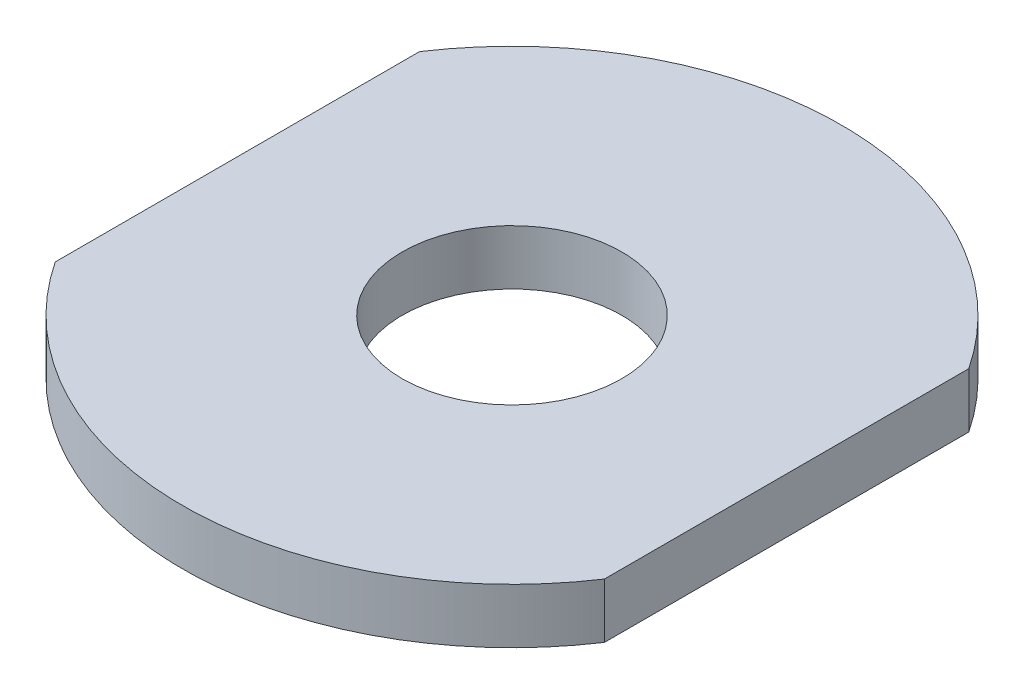
ISO-10303-21;
HEADER;
FILE_DESCRIPTION(('STEP AP214'),'2;1');
FILE_NAME('part.step','',(''),(''),'','','');
FILE_SCHEMA(('AUTOMOTIVE_DESIGN { 1 0 10303 214 1 1 1 1 }'));
ENDSEC;
DATA;
#1=APPLICATION_CONTEXT('core data for automotive mechanical design processes');
#2=APPLICATION_PROTOCOL_DEFINITION('international standard','automotive_design',2000,#1);
#3=PRODUCT_CONTEXT('',#1,'mechanical');
#4=PRODUCT('Part','Part','',(#3));
#5=PRODUCT_RELATED_PRODUCT_CATEGORY('part','',(#4));
#6=PRODUCT_DEFINITION_FORMATION('','',#4);
#7=PRODUCT_DEFINITION_CONTEXT('part definition',#1,'design');
#8=PRODUCT_DEFINITION('design','',#6,#7);
#9=PRODUCT_DEFINITION_SHAPE('','',#8);
#10=(LENGTH_UNIT() NAMED_UNIT(*) SI_UNIT(.MILLI.,.METRE.));
#11=(NAMED_UNIT(*) PLANE_ANGLE_UNIT() SI_UNIT($,.RADIAN.));
#12=(NAMED_UNIT(*) SI_UNIT($,.STERADIAN.) SOLID_ANGLE_UNIT());
#13=UNCERTAINTY_MEASURE_WITH_UNIT(LENGTH_MEASURE(1.E-05),#10,'distance_accuracy_value','');
#14=(GEOMETRIC_REPRESENTATION_CONTEXT(3) GLOBAL_UNCERTAINTY_ASSIGNED_CONTEXT((#13)) GLOBAL_UNIT_ASSIGNED_CONTEXT((#10,
#11,#12)) REPRESENTATION_CONTEXT('',''));
#15=CARTESIAN_POINT('',(0.,0.,0.));
#16=DIRECTION('',(0.,0.,1.));
#17=DIRECTION('',(1.,0.,0.));
#18=AXIS2_PLACEMENT_3D('',#15,#16,#17);
#19=CARTESIAN_POINT('',(0.,1.,0.));
#20=DIRECTION('',(0.,-1.,0.));
#21=DIRECTION('',(0.,0.,-1.));
#22=AXIS2_PLACEMENT_3D('',#19,#20,#21);
#23=CYLINDRICAL_SURFACE('',#22,6.);
#24=CARTESIAN_POINT('',(0.,1.,0.));
#25=DIRECTION('',(0.,1.,0.));
#26=DIRECTION('',(0.,0.,1.));
#27=AXIS2_PLACEMENT_3D('',#24,#25,#26);
#28=CIRCLE('',#27,6.);
#29=CARTESIAN_POINT('',(-5.,1.,3.3166247903554));
#30=VERTEX_POINT('',#29);
#31=CARTESIAN_POINT('',(5.,1.,3.3166247903554));
#32=VERTEX_POINT('',#31);
#33=EDGE_CURVE('E42',#30,#32,#28,.T.);
#34=ORIENTED_EDGE('',*,*,#33,.F.);
#35=DIRECTION('',(0.,1.,0.));
#36=VECTOR('',#35,1.);
#37=CARTESIAN_POINT('',(-5.,0.,3.3166247903554));
#38=LINE('',#37,#36);
#39=CARTESIAN_POINT('',(-5.,0.,3.3166247903554));
#40=VERTEX_POINT('',#39);
#41=EDGE_CURVE('E76',#40,#30,#38,.T.);
#42=ORIENTED_EDGE('',*,*,#41,.F.);
#43=CARTESIAN_POINT('',(0.,0.,0.));
#44=DIRECTION('',(0.,1.,0.));
#45=DIRECTION('',(0.,0.,1.));
#46=AXIS2_PLACEMENT_3D('',#43,#44,#45);
#47=CIRCLE('',#46,6.);
#48=CARTESIAN_POINT('',(5.,0.,3.3166247903554));
#49=VERTEX_POINT('',#48);
#50=EDGE_CURVE('E37',#40,#49,#47,.T.);
#51=ORIENTED_EDGE('',*,*,#50,.T.);
#52=DIRECTION('',(0.,1.,0.));
#53=VECTOR('',#52,1.);
#54=CARTESIAN_POINT('',(5.,0.,3.3166247903554));
#55=LINE('',#54,#53);
#56=EDGE_CURVE('E108',#49,#32,#55,.T.);
#57=ORIENTED_EDGE('',*,*,#56,.T.);
#58=EDGE_LOOP('',(#34,#42,#51,#57));
#59=FACE_BOUND('',#58,.T.);
#60=ADVANCED_FACE('F33',(#59),#23,.T.);
#61=CARTESIAN_POINT('',(0.,1.,0.));
#62=DIRECTION('',(0.,1.,0.));
#63=DIRECTION('',(0.,0.,1.));
#64=AXIS2_PLACEMENT_3D('',#61,#62,#63);
#65=PLANE('',#64);
#66=DIRECTION('',(0.,0.,-1.));
#67=VECTOR('',#66,1.);
#68=CARTESIAN_POINT('',(-5.,1.,3.3166247903554));
#69=LINE('',#68,#67);
#70=CARTESIAN_POINT('',(-5.,1.,-3.3166247903554));
#71=VERTEX_POINT('',#70);
#72=EDGE_CURVE('E49',#30,#71,#69,.T.);
#73=ORIENTED_EDGE('',*,*,#72,.F.);
#74=ORIENTED_EDGE('',*,*,#33,.T.);
#75=DIRECTION('',(0.,0.,1.));
#76=VECTOR('',#75,1.);
#77=CARTESIAN_POINT('',(5.,1.,-3.3166247903554));
#78=LINE('',#77,#76);
#79=CARTESIAN_POINT('',(5.,1.,-3.3166247903554));
#80=VERTEX_POINT('',#79);
#81=EDGE_CURVE('E57',#80,#32,#78,.T.);
#82=ORIENTED_EDGE('',*,*,#81,.F.);
#83=EDGE_CURVE('E11',#80,#71,#28,.T.);
#84=ORIENTED_EDGE('',*,*,#83,.T.);
#85=EDGE_LOOP('',(#73,#74,#82,#84));
#86=FACE_BOUND('',#85,.T.);
#87=CARTESIAN_POINT('',(0.,1.,0.));
#88=DIRECTION('',(0.,1.,0.));
#89=DIRECTION('',(0.,0.,1.));
#90=AXIS2_PLACEMENT_3D('',#87,#88,#89);
#91=CIRCLE('',#90,2.);
#92=CARTESIAN_POINT('',(0.,1.,2.));
#93=VERTEX_POINT('',#92);
#94=EDGE_CURVE('E93',#93,#93,#91,.T.);
#95=ORIENTED_EDGE('',*,*,#94,.F.);
#96=EDGE_LOOP('',(#95));
#97=FACE_BOUND('',#96,.T.);
#98=ADVANCED_FACE('F105',(#86,#97),#65,.T.);
#99=CARTESIAN_POINT('',(0.,0.,0.));
#100=DIRECTION('',(0.,1.,0.));
#101=DIRECTION('',(0.,0.,1.));
#102=AXIS2_PLACEMENT_3D('',#99,#100,#101);
#103=PLANE('',#102);
#104=ORIENTED_EDGE('',*,*,#50,.F.);
#105=DIRECTION('',(0.,0.,-1.));
#106=VECTOR('',#105,1.);
#107=CARTESIAN_POINT('',(-5.,0.,3.3166247903554));
#108=LINE('',#107,#106);
#109=CARTESIAN_POINT('',(-5.,0.,-3.3166247903554));
#110=VERTEX_POINT('',#109);
#111=EDGE_CURVE('E73',#40,#110,#108,.T.);
#112=ORIENTED_EDGE('',*,*,#111,.T.);
#113=CARTESIAN_POINT('',(5.,0.,-3.3166247903554));
#114=VERTEX_POINT('',#113);
#115=EDGE_CURVE('E92',#114,#110,#47,.T.);
#116=ORIENTED_EDGE('',*,*,#115,.F.);
#117=DIRECTION('',(0.,0.,1.));
#118=VECTOR('',#117,1.);
#119=CARTESIAN_POINT('',(5.,0.,-3.3166247903554));
#120=LINE('',#119,#118);
#121=EDGE_CURVE('E91',#114,#49,#120,.T.);
#122=ORIENTED_EDGE('',*,*,#121,.T.);
#123=EDGE_LOOP('',(#104,#112,#116,#122));
#124=FACE_BOUND('',#123,.T.);
#125=CARTESIAN_POINT('',(0.,0.,0.));
#126=DIRECTION('',(0.,1.,0.));
#127=DIRECTION('',(0.,0.,1.));
#128=AXIS2_PLACEMENT_3D('',#125,#126,#127);
#129=CIRCLE('',#128,2.);
#130=CARTESIAN_POINT('',(0.,0.,2.));
#131=VERTEX_POINT('',#130);
#132=EDGE_CURVE('E95',#131,#131,#129,.T.);
#133=ORIENTED_EDGE('',*,*,#132,.T.);
#134=EDGE_LOOP('',(#133));
#135=FACE_BOUND('',#134,.T.);
#136=ADVANCED_FACE('F89',(#124,#135),#103,.F.);
#137=ORIENTED_EDGE('',*,*,#115,.T.);
#138=DIRECTION('',(0.,1.,0.));
#139=VECTOR('',#138,1.);
#140=CARTESIAN_POINT('',(-5.,0.,-3.3166247903554));
#141=LINE('',#140,#139);
#142=EDGE_CURVE('E77',#110,#71,#141,.T.);
#143=ORIENTED_EDGE('',*,*,#142,.T.);
#144=ORIENTED_EDGE('',*,*,#83,.F.);
#145=DIRECTION('',(0.,1.,0.));
#146=VECTOR('',#145,1.);
#147=CARTESIAN_POINT('',(5.,0.,-3.3166247903554));
#148=LINE('',#147,#146);
#149=EDGE_CURVE('E102',#114,#80,#148,.T.);
#150=ORIENTED_EDGE('',*,*,#149,.F.);
#151=EDGE_LOOP('',(#137,#143,#144,#150));
#152=FACE_BOUND('',#151,.T.);
#153=ADVANCED_FACE('F35',(#152),#23,.T.);
#154=CARTESIAN_POINT('',(0.,1.,0.));
#155=DIRECTION('',(0.,-1.,0.));
#156=DIRECTION('',(0.,0.,-1.));
#157=AXIS2_PLACEMENT_3D('',#154,#155,#156);
#158=CYLINDRICAL_SURFACE('',#157,2.);
#159=ORIENTED_EDGE('',*,*,#94,.T.);
#160=EDGE_LOOP('',(#159));
#161=FACE_BOUND('',#160,.T.);
#162=ORIENTED_EDGE('',*,*,#132,.F.);
#163=EDGE_LOOP('',(#162));
#164=FACE_BOUND('',#163,.T.);
#165=ADVANCED_FACE('F117',(#161,#164),#158,.F.);
#166=CARTESIAN_POINT('',(5.,0.,-3.3166247903554));
#167=DIRECTION('',(-1.,0.,0.));
#168=DIRECTION('',(0.,0.,1.));
#169=AXIS2_PLACEMENT_3D('',#166,#167,#168);
#170=PLANE('',#169);
#171=ORIENTED_EDGE('',*,*,#81,.T.);
#172=ORIENTED_EDGE('',*,*,#56,.F.);
#173=ORIENTED_EDGE('',*,*,#121,.F.);
#174=ORIENTED_EDGE('',*,*,#149,.T.);
#175=EDGE_LOOP('',(#171,#172,#173,#174));
#176=FACE_BOUND('',#175,.T.);
#177=ADVANCED_FACE('F114',(#176),#170,.F.);
#178=CARTESIAN_POINT('',(-5.,0.,3.3166247903554));
#179=DIRECTION('',(1.,0.,0.));
#180=DIRECTION('',(0.,0.,-1.));
#181=AXIS2_PLACEMENT_3D('',#178,#179,#180);
#182=PLANE('',#181);
#183=ORIENTED_EDGE('',*,*,#72,.T.);
#184=ORIENTED_EDGE('',*,*,#142,.F.);
#185=ORIENTED_EDGE('',*,*,#111,.F.);
#186=ORIENTED_EDGE('',*,*,#41,.T.);
#187=EDGE_LOOP('',(#183,#184,#185,#186));
#188=FACE_BOUND('',#187,.T.);
#189=ADVANCED_FACE('F75',(#188),#182,.F.);
#190=CLOSED_SHELL('',(#60,#98,#136,#153,#165,#177,#189));
#191=MANIFOLD_SOLID_BREP('B2',#190);
#192=ADVANCED_BREP_SHAPE_REPRESENTATION('',(#18,#191),#14);
#193=SHAPE_DEFINITION_REPRESENTATION(#9,#192);
ENDSEC;
END-ISO-10303-21;
